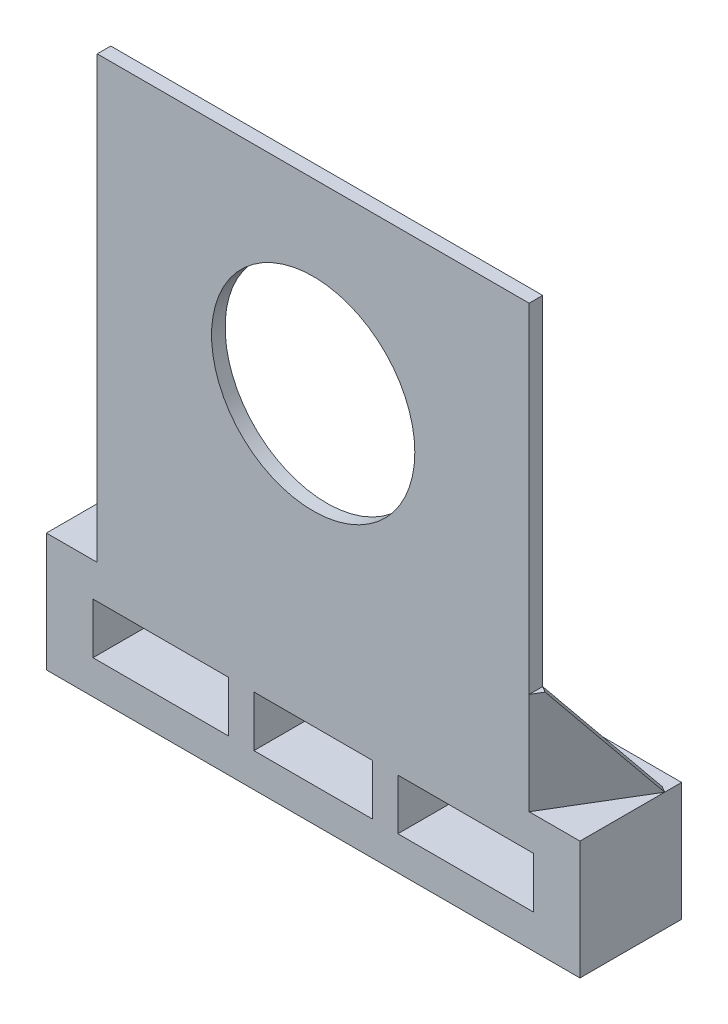
ISO-10303-21;
HEADER;
FILE_DESCRIPTION(('STEP AP214'),'2;1');
FILE_NAME('part.step','',(''),(''),'','','');
FILE_SCHEMA(('AUTOMOTIVE_DESIGN { 1 0 10303 214 1 1 1 1 }'));
ENDSEC;
DATA;
#1=APPLICATION_CONTEXT('core data for automotive mechanical design processes');
#2=APPLICATION_PROTOCOL_DEFINITION('international standard','automotive_design',2000,#1);
#3=PRODUCT_CONTEXT('',#1,'mechanical');
#4=PRODUCT('Part','Part','',(#3));
#5=PRODUCT_RELATED_PRODUCT_CATEGORY('part','',(#4));
#6=PRODUCT_DEFINITION_FORMATION('','',#4);
#7=PRODUCT_DEFINITION_CONTEXT('part definition',#1,'design');
#8=PRODUCT_DEFINITION('design','',#6,#7);
#9=PRODUCT_DEFINITION_SHAPE('','',#8);
#10=(LENGTH_UNIT() NAMED_UNIT(*) SI_UNIT(.MILLI.,.METRE.));
#11=(NAMED_UNIT(*) PLANE_ANGLE_UNIT() SI_UNIT($,.RADIAN.));
#12=(NAMED_UNIT(*) SI_UNIT($,.STERADIAN.) SOLID_ANGLE_UNIT());
#13=UNCERTAINTY_MEASURE_WITH_UNIT(LENGTH_MEASURE(1.E-05),#10,'distance_accuracy_value','');
#14=(GEOMETRIC_REPRESENTATION_CONTEXT(3) GLOBAL_UNCERTAINTY_ASSIGNED_CONTEXT((#13)) GLOBAL_UNIT_ASSIGNED_CONTEXT((#10,
#11,#12)) REPRESENTATION_CONTEXT('',''));
#15=CARTESIAN_POINT('',(0.,0.,0.));
#16=DIRECTION('',(0.,0.,1.));
#17=DIRECTION('',(1.,0.,0.));
#18=AXIS2_PLACEMENT_3D('',#15,#16,#17);
#19=CARTESIAN_POINT('',(0.,-130.,-52.));
#20=DIRECTION('',(0.,1.,0.));
#21=DIRECTION('',(0.,0.,1.));
#22=AXIS2_PLACEMENT_3D('',#19,#20,#21);
#23=PLANE('',#22);
#24=DIRECTION('',(0.857492925712544,0.,-0.514495755427527));
#25=VECTOR('',#24,1.);
#26=CARTESIAN_POINT('',(-157.5,-130.,-42.));
#27=LINE('',#26,#25);
#28=CARTESIAN_POINT('',(-157.5,-130.,-42.));
#29=VERTEX_POINT('',#28);
#30=CARTESIAN_POINT('',(-153.970588235294,-130.,-44.1176470588236));
#31=VERTEX_POINT('',#30);
#32=EDGE_CURVE('E206',#29,#31,#27,.T.);
#33=ORIENTED_EDGE('',*,*,#32,.T.);
#34=DIRECTION('',(0.514495755427527,0.,0.857492925712544));
#35=VECTOR('',#34,1.);
#36=CARTESIAN_POINT('',(-127.5,-130.,0.));
#37=LINE('',#36,#35);
#38=CARTESIAN_POINT('',(-127.5,-130.,0.));
#39=VERTEX_POINT('',#38);
#40=EDGE_CURVE('E215',#31,#39,#37,.T.);
#41=ORIENTED_EDGE('',*,*,#40,.T.);
#42=DIRECTION('',(1.,0.,0.));
#43=VECTOR('',#42,1.);
#44=CARTESIAN_POINT('',(-127.5,-130.,0.));
#45=LINE('',#44,#43);
#46=CARTESIAN_POINT('',(127.5,-130.,0.));
#47=VERTEX_POINT('',#46);
#48=EDGE_CURVE('E275',#39,#47,#45,.T.);
#49=ORIENTED_EDGE('',*,*,#48,.T.);
#50=DIRECTION('',(-0.514495755427527,0.,0.857492925712544));
#51=VECTOR('',#50,1.);
#52=CARTESIAN_POINT('',(127.5,-130.,0.));
#53=LINE('',#52,#51);
#54=CARTESIAN_POINT('',(153.970588235294,-130.,-44.1176470588235));
#55=VERTEX_POINT('',#54);
#56=EDGE_CURVE('E309',#55,#47,#53,.T.);
#57=ORIENTED_EDGE('',*,*,#56,.F.);
#58=DIRECTION('',(-0.857492925712544,0.,-0.514495755427527));
#59=VECTOR('',#58,1.);
#60=CARTESIAN_POINT('',(157.5,-130.,-42.));
#61=LINE('',#60,#59);
#62=CARTESIAN_POINT('',(157.5,-130.,-42.));
#63=VERTEX_POINT('',#62);
#64=EDGE_CURVE('E314',#63,#55,#61,.T.);
#65=ORIENTED_EDGE('',*,*,#64,.F.);
#66=DIRECTION('',(0.,0.,1.));
#67=VECTOR('',#66,1.);
#68=CARTESIAN_POINT('',(157.5,-130.,-52.));
#69=LINE('',#68,#67);
#70=CARTESIAN_POINT('',(157.5,-130.,-52.));
#71=VERTEX_POINT('',#70);
#72=EDGE_CURVE('E256',#71,#63,#69,.T.);
#73=ORIENTED_EDGE('',*,*,#72,.F.);
#74=DIRECTION('',(-1.,0.,0.));
#75=VECTOR('',#74,1.);
#76=CARTESIAN_POINT('',(-157.5,-130.,-52.));
#77=LINE('',#76,#75);
#78=CARTESIAN_POINT('',(-157.5,-130.,-52.));
#79=VERTEX_POINT('',#78);
#80=EDGE_CURVE('E243',#71,#79,#77,.T.);
#81=ORIENTED_EDGE('',*,*,#80,.T.);
#82=DIRECTION('',(0.,0.,1.));
#83=VECTOR('',#82,1.);
#84=CARTESIAN_POINT('',(-157.5,-130.,-52.));
#85=LINE('',#84,#83);
#86=EDGE_CURVE('E236',#79,#29,#85,.T.);
#87=ORIENTED_EDGE('',*,*,#86,.T.);
#88=EDGE_LOOP('',(#33,#41,#49,#57,#65,#73,#81,#87));
#89=FACE_BOUND('',#88,.T.);
#90=ADVANCED_FACE('F41',(#89),#23,.T.);
#91=CARTESIAN_POINT('',(157.5,-130.,8.));
#92=VERTEX_POINT('',#91);
#93=EDGE_CURVE('E429',#63,#92,#69,.T.);
#94=ORIENTED_EDGE('',*,*,#93,.F.);
#95=DIRECTION('',(0.514495755427527,0.,-0.857492925712544));
#96=VECTOR('',#95,1.);
#97=CARTESIAN_POINT('',(127.5,-130.,8.));
#98=LINE('',#97,#96);
#99=CARTESIAN_POINT('',(127.5,-130.,8.));
#100=VERTEX_POINT('',#99);
#101=EDGE_CURVE('E297',#100,#63,#98,.T.);
#102=ORIENTED_EDGE('',*,*,#101,.F.);
#103=DIRECTION('',(-1.,0.,0.));
#104=VECTOR('',#103,1.);
#105=CARTESIAN_POINT('',(0.,-130.,8.));
#106=LINE('',#105,#104);
#107=EDGE_CURVE('E412',#92,#100,#106,.T.);
#108=ORIENTED_EDGE('',*,*,#107,.F.);
#109=EDGE_LOOP('',(#94,#102,#108));
#110=FACE_BOUND('',#109,.T.);
#111=ADVANCED_FACE('F441',(#110),#23,.T.);
#112=DIRECTION('',(-0.514495755427527,0.,-0.857492925712544));
#113=VECTOR('',#112,1.);
#114=CARTESIAN_POINT('',(-127.5,-130.,8.));
#115=LINE('',#114,#113);
#116=CARTESIAN_POINT('',(-127.5,-130.,8.));
#117=VERTEX_POINT('',#116);
#118=EDGE_CURVE('E214',#117,#29,#115,.T.);
#119=ORIENTED_EDGE('',*,*,#118,.T.);
#120=CARTESIAN_POINT('',(-157.5,-130.,8.));
#121=VERTEX_POINT('',#120);
#122=EDGE_CURVE('E226',#29,#121,#85,.T.);
#123=ORIENTED_EDGE('',*,*,#122,.T.);
#124=EDGE_CURVE('E228',#117,#121,#106,.T.);
#125=ORIENTED_EDGE('',*,*,#124,.F.);
#126=EDGE_LOOP('',(#119,#123,#125));
#127=FACE_BOUND('',#126,.T.);
#128=ADVANCED_FACE('F225',(#127),#23,.T.);
#129=CARTESIAN_POINT('',(0.,0.,8.));
#130=DIRECTION('',(0.,0.,1.));
#131=DIRECTION('',(1.,0.,0.));
#132=AXIS2_PLACEMENT_3D('',#129,#130,#131);
#133=PLANE('',#132);
#134=DIRECTION('',(0.,1.,0.));
#135=VECTOR('',#134,1.);
#136=CARTESIAN_POINT('',(127.5,130.,8.));
#137=LINE('',#136,#135);
#138=CARTESIAN_POINT('',(127.5,-70.,8.));
#139=VERTEX_POINT('',#138);
#140=EDGE_CURVE('E257',#100,#139,#137,.T.);
#141=ORIENTED_EDGE('',*,*,#140,.T.);
#142=CARTESIAN_POINT('',(127.5,130.,8.));
#143=VERTEX_POINT('',#142);
#144=EDGE_CURVE('E261',#139,#143,#137,.T.);
#145=ORIENTED_EDGE('',*,*,#144,.T.);
#146=DIRECTION('',(-1.,0.,0.));
#147=VECTOR('',#146,1.);
#148=CARTESIAN_POINT('',(-127.5,130.,8.));
#149=LINE('',#148,#147);
#150=CARTESIAN_POINT('',(-127.5,130.,8.));
#151=VERTEX_POINT('',#150);
#152=EDGE_CURVE('E260',#143,#151,#149,.T.);
#153=ORIENTED_EDGE('',*,*,#152,.T.);
#154=DIRECTION('',(0.,-1.,0.));
#155=VECTOR('',#154,1.);
#156=CARTESIAN_POINT('',(-127.5,130.,8.));
#157=LINE('',#156,#155);
#158=CARTESIAN_POINT('',(-127.5,-70.,8.));
#159=VERTEX_POINT('',#158);
#160=EDGE_CURVE('E263',#151,#159,#157,.T.);
#161=ORIENTED_EDGE('',*,*,#160,.T.);
#162=DIRECTION('',(0.,-1.,0.));
#163=VECTOR('',#162,1.);
#164=CARTESIAN_POINT('',(-127.5,-70.,8.));
#165=LINE('',#164,#163);
#166=EDGE_CURVE('E492',#159,#117,#165,.T.);
#167=ORIENTED_EDGE('',*,*,#166,.T.);
#168=ORIENTED_EDGE('',*,*,#124,.T.);
#169=DIRECTION('',(0.,-1.,0.));
#170=VECTOR('',#169,1.);
#171=CARTESIAN_POINT('',(-157.5,-200.,8.));
#172=LINE('',#171,#170);
#173=CARTESIAN_POINT('',(-157.5,-200.,8.));
#174=VERTEX_POINT('',#173);
#175=EDGE_CURVE('E239',#121,#174,#172,.T.);
#176=ORIENTED_EDGE('',*,*,#175,.T.);
#177=DIRECTION('',(1.,0.,0.));
#178=VECTOR('',#177,1.);
#179=CARTESIAN_POINT('',(157.5,-200.,8.));
#180=LINE('',#179,#178);
#181=CARTESIAN_POINT('',(157.5,-200.,8.));
#182=VERTEX_POINT('',#181);
#183=EDGE_CURVE('E420',#174,#182,#180,.T.);
#184=ORIENTED_EDGE('',*,*,#183,.T.);
#185=DIRECTION('',(0.,1.,0.));
#186=VECTOR('',#185,1.);
#187=CARTESIAN_POINT('',(157.5,-130.,8.));
#188=LINE('',#187,#186);
#189=EDGE_CURVE('E423',#182,#92,#188,.T.);
#190=ORIENTED_EDGE('',*,*,#189,.T.);
#191=ORIENTED_EDGE('',*,*,#107,.T.);
#192=EDGE_LOOP('',(#141,#145,#153,#161,#167,#168,#176,#184,#190,#191));
#193=FACE_BOUND('',#192,.T.);
#194=CARTESIAN_POINT('',(0.,20.,8.));
#195=DIRECTION('',(0.,0.,1.));
#196=DIRECTION('',(1.,0.,0.));
#197=AXIS2_PLACEMENT_3D('',#194,#195,#196);
#198=CIRCLE('',#197,60.);
#199=CARTESIAN_POINT('',(60.,20.,8.));
#200=VERTEX_POINT('',#199);
#201=EDGE_CURVE('E249',#200,#200,#198,.T.);
#202=ORIENTED_EDGE('',*,*,#201,.F.);
#203=EDGE_LOOP('',(#202));
#204=FACE_BOUND('',#203,.T.);
#205=DIRECTION('',(-1.,0.,0.));
#206=VECTOR('',#205,1.);
#207=CARTESIAN_POINT('',(-130.,-150.,8.));
#208=LINE('',#207,#206);
#209=CARTESIAN_POINT('',(-50.,-150.,8.));
#210=VERTEX_POINT('',#209);
#211=CARTESIAN_POINT('',(-130.,-150.,8.));
#212=VERTEX_POINT('',#211);
#213=EDGE_CURVE('E307',#210,#212,#208,.T.);
#214=ORIENTED_EDGE('',*,*,#213,.F.);
#215=DIRECTION('',(0.,1.,0.));
#216=VECTOR('',#215,1.);
#217=CARTESIAN_POINT('',(-50.,-150.,8.));
#218=LINE('',#217,#216);
#219=CARTESIAN_POINT('',(-50.,-180.,8.));
#220=VERTEX_POINT('',#219);
#221=EDGE_CURVE('E305',#220,#210,#218,.T.);
#222=ORIENTED_EDGE('',*,*,#221,.F.);
#223=DIRECTION('',(1.,0.,0.));
#224=VECTOR('',#223,1.);
#225=CARTESIAN_POINT('',(-130.,-180.,8.));
#226=LINE('',#225,#224);
#227=CARTESIAN_POINT('',(-130.,-180.,8.));
#228=VERTEX_POINT('',#227);
#229=EDGE_CURVE('E321',#228,#220,#226,.T.);
#230=ORIENTED_EDGE('',*,*,#229,.F.);
#231=DIRECTION('',(0.,-1.,0.));
#232=VECTOR('',#231,1.);
#233=CARTESIAN_POINT('',(-130.,-150.,8.));
#234=LINE('',#233,#232);
#235=EDGE_CURVE('E333',#212,#228,#234,.T.);
#236=ORIENTED_EDGE('',*,*,#235,.F.);
#237=EDGE_LOOP('',(#214,#222,#230,#236));
#238=FACE_BOUND('',#237,.T.);
#239=DIRECTION('',(-1.,0.,0.));
#240=VECTOR('',#239,1.);
#241=CARTESIAN_POINT('',(50.,-150.,8.));
#242=LINE('',#241,#240);
#243=CARTESIAN_POINT('',(130.,-150.,8.));
#244=VERTEX_POINT('',#243);
#245=CARTESIAN_POINT('',(50.,-150.,8.));
#246=VERTEX_POINT('',#245);
#247=EDGE_CURVE('E362',#244,#246,#242,.T.);
#248=ORIENTED_EDGE('',*,*,#247,.F.);
#249=DIRECTION('',(0.,1.,0.));
#250=VECTOR('',#249,1.);
#251=CARTESIAN_POINT('',(130.,-150.,8.));
#252=LINE('',#251,#250);
#253=CARTESIAN_POINT('',(130.,-180.,8.));
#254=VERTEX_POINT('',#253);
#255=EDGE_CURVE('E340',#254,#244,#252,.T.);
#256=ORIENTED_EDGE('',*,*,#255,.F.);
#257=DIRECTION('',(1.,0.,0.));
#258=VECTOR('',#257,1.);
#259=CARTESIAN_POINT('',(50.,-180.,8.));
#260=LINE('',#259,#258);
#261=CARTESIAN_POINT('',(50.,-180.,8.));
#262=VERTEX_POINT('',#261);
#263=EDGE_CURVE('E351',#262,#254,#260,.T.);
#264=ORIENTED_EDGE('',*,*,#263,.F.);
#265=DIRECTION('',(0.,-1.,0.));
#266=VECTOR('',#265,1.);
#267=CARTESIAN_POINT('',(50.,-150.,8.));
#268=LINE('',#267,#266);
#269=EDGE_CURVE('E365',#246,#262,#268,.T.);
#270=ORIENTED_EDGE('',*,*,#269,.F.);
#271=EDGE_LOOP('',(#248,#256,#264,#270));
#272=FACE_BOUND('',#271,.T.);
#273=DIRECTION('',(-1.,0.,0.));
#274=VECTOR('',#273,1.);
#275=CARTESIAN_POINT('',(-35.,-150.,8.));
#276=LINE('',#275,#274);
#277=CARTESIAN_POINT('',(35.,-150.,8.));
#278=VERTEX_POINT('',#277);
#279=CARTESIAN_POINT('',(-35.,-150.,8.));
#280=VERTEX_POINT('',#279);
#281=EDGE_CURVE('E394',#278,#280,#276,.T.);
#282=ORIENTED_EDGE('',*,*,#281,.F.);
#283=DIRECTION('',(0.,1.,0.));
#284=VECTOR('',#283,1.);
#285=CARTESIAN_POINT('',(35.,-150.,8.));
#286=LINE('',#285,#284);
#287=CARTESIAN_POINT('',(35.,-180.,8.));
#288=VERTEX_POINT('',#287);
#289=EDGE_CURVE('E372',#288,#278,#286,.T.);
#290=ORIENTED_EDGE('',*,*,#289,.F.);
#291=DIRECTION('',(1.,0.,0.));
#292=VECTOR('',#291,1.);
#293=CARTESIAN_POINT('',(-35.,-180.,8.));
#294=LINE('',#293,#292);
#295=CARTESIAN_POINT('',(-35.,-180.,8.));
#296=VERTEX_POINT('',#295);
#297=EDGE_CURVE('E383',#296,#288,#294,.T.);
#298=ORIENTED_EDGE('',*,*,#297,.F.);
#299=DIRECTION('',(0.,-1.,0.));
#300=VECTOR('',#299,1.);
#301=CARTESIAN_POINT('',(-35.,-150.,8.));
#302=LINE('',#301,#300);
#303=EDGE_CURVE('E397',#280,#296,#302,.T.);
#304=ORIENTED_EDGE('',*,*,#303,.F.);
#305=EDGE_LOOP('',(#282,#290,#298,#304));
#306=FACE_BOUND('',#305,.T.);
#307=ADVANCED_FACE('F439',(#193,#204,#238,#272,#306),#133,.T.);
#308=CARTESIAN_POINT('',(0.,0.,0.));
#309=DIRECTION('',(0.,0.,1.));
#310=DIRECTION('',(1.,0.,0.));
#311=AXIS2_PLACEMENT_3D('',#308,#309,#310);
#312=PLANE('',#311);
#313=DIRECTION('',(0.,1.,0.));
#314=VECTOR('',#313,1.);
#315=CARTESIAN_POINT('',(127.5,130.,0.));
#316=LINE('',#315,#314);
#317=CARTESIAN_POINT('',(127.5,-70.,0.));
#318=VERTEX_POINT('',#317);
#319=EDGE_CURVE('E267',#47,#318,#316,.T.);
#320=ORIENTED_EDGE('',*,*,#319,.F.);
#321=ORIENTED_EDGE('',*,*,#48,.F.);
#322=DIRECTION('',(0.,-1.,0.));
#323=VECTOR('',#322,1.);
#324=CARTESIAN_POINT('',(-127.5,-70.,0.));
#325=LINE('',#324,#323);
#326=CARTESIAN_POINT('',(-127.5,-70.,0.));
#327=VERTEX_POINT('',#326);
#328=EDGE_CURVE('E299',#327,#39,#325,.T.);
#329=ORIENTED_EDGE('',*,*,#328,.F.);
#330=DIRECTION('',(0.,-1.,0.));
#331=VECTOR('',#330,1.);
#332=CARTESIAN_POINT('',(-127.5,130.,0.));
#333=LINE('',#332,#331);
#334=CARTESIAN_POINT('',(-127.5,130.,0.));
#335=VERTEX_POINT('',#334);
#336=EDGE_CURVE('E272',#335,#327,#333,.T.);
#337=ORIENTED_EDGE('',*,*,#336,.F.);
#338=DIRECTION('',(-1.,0.,0.));
#339=VECTOR('',#338,1.);
#340=CARTESIAN_POINT('',(-127.5,130.,0.));
#341=LINE('',#340,#339);
#342=CARTESIAN_POINT('',(127.5,130.,0.));
#343=VERTEX_POINT('',#342);
#344=EDGE_CURVE('E270',#343,#335,#341,.T.);
#345=ORIENTED_EDGE('',*,*,#344,.F.);
#346=EDGE_CURVE('E252',#318,#343,#316,.T.);
#347=ORIENTED_EDGE('',*,*,#346,.F.);
#348=EDGE_LOOP('',(#320,#321,#329,#337,#345,#347));
#349=FACE_BOUND('',#348,.T.);
#350=CARTESIAN_POINT('',(0.,20.,0.));
#351=DIRECTION('',(0.,0.,1.));
#352=DIRECTION('',(1.,0.,0.));
#353=AXIS2_PLACEMENT_3D('',#350,#351,#352);
#354=CIRCLE('',#353,60.);
#355=CARTESIAN_POINT('',(60.,20.,0.));
#356=VERTEX_POINT('',#355);
#357=EDGE_CURVE('E253',#356,#356,#354,.T.);
#358=ORIENTED_EDGE('',*,*,#357,.T.);
#359=EDGE_LOOP('',(#358));
#360=FACE_BOUND('',#359,.T.);
#361=ADVANCED_FACE('F466',(#349,#360),#312,.F.);
#362=CARTESIAN_POINT('',(127.5,130.,8.));
#363=DIRECTION('',(-1.,0.,0.));
#364=DIRECTION('',(0.,0.,1.));
#365=AXIS2_PLACEMENT_3D('',#362,#363,#364);
#366=PLANE('',#365);
#367=ORIENTED_EDGE('',*,*,#144,.F.);
#368=DIRECTION('',(0.,0.,1.));
#369=VECTOR('',#368,1.);
#370=CARTESIAN_POINT('',(127.5,-70.,8.));
#371=LINE('',#370,#369);
#372=EDGE_CURVE('E303',#318,#139,#371,.T.);
#373=ORIENTED_EDGE('',*,*,#372,.F.);
#374=ORIENTED_EDGE('',*,*,#346,.T.);
#375=DIRECTION('',(0.,0.,-1.));
#376=VECTOR('',#375,1.);
#377=CARTESIAN_POINT('',(127.5,130.,8.));
#378=LINE('',#377,#376);
#379=EDGE_CURVE('E280',#143,#343,#378,.T.);
#380=ORIENTED_EDGE('',*,*,#379,.F.);
#381=EDGE_LOOP('',(#367,#373,#374,#380));
#382=FACE_BOUND('',#381,.T.);
#383=ADVANCED_FACE('F43',(#382),#366,.F.);
#384=CARTESIAN_POINT('',(-127.5,130.,8.));
#385=DIRECTION('',(0.,-1.,0.));
#386=DIRECTION('',(0.,0.,-1.));
#387=AXIS2_PLACEMENT_3D('',#384,#385,#386);
#388=PLANE('',#387);
#389=ORIENTED_EDGE('',*,*,#344,.T.);
#390=DIRECTION('',(0.,0.,-1.));
#391=VECTOR('',#390,1.);
#392=CARTESIAN_POINT('',(-127.5,130.,8.));
#393=LINE('',#392,#391);
#394=EDGE_CURVE('E266',#151,#335,#393,.T.);
#395=ORIENTED_EDGE('',*,*,#394,.F.);
#396=ORIENTED_EDGE('',*,*,#152,.F.);
#397=ORIENTED_EDGE('',*,*,#379,.T.);
#398=EDGE_LOOP('',(#389,#395,#396,#397));
#399=FACE_BOUND('',#398,.T.);
#400=ADVANCED_FACE('F471',(#399),#388,.F.);
#401=CARTESIAN_POINT('',(-127.5,130.,8.));
#402=DIRECTION('',(1.,0.,0.));
#403=DIRECTION('',(0.,1.,0.));
#404=AXIS2_PLACEMENT_3D('',#401,#402,#403);
#405=PLANE('',#404);
#406=ORIENTED_EDGE('',*,*,#336,.T.);
#407=DIRECTION('',(0.,0.,1.));
#408=VECTOR('',#407,1.);
#409=CARTESIAN_POINT('',(-127.5,-70.,8.));
#410=LINE('',#409,#408);
#411=EDGE_CURVE('E229',#327,#159,#410,.T.);
#412=ORIENTED_EDGE('',*,*,#411,.T.);
#413=ORIENTED_EDGE('',*,*,#160,.F.);
#414=ORIENTED_EDGE('',*,*,#394,.T.);
#415=EDGE_LOOP('',(#406,#412,#413,#414));
#416=FACE_BOUND('',#415,.T.);
#417=ADVANCED_FACE('F462',(#416),#405,.F.);
#418=CARTESIAN_POINT('',(0.,20.,8.));
#419=DIRECTION('',(0.,0.,-1.));
#420=DIRECTION('',(-1.,0.,0.));
#421=AXIS2_PLACEMENT_3D('',#418,#419,#420);
#422=CYLINDRICAL_SURFACE('',#421,60.);
#423=ORIENTED_EDGE('',*,*,#201,.T.);
#424=EDGE_LOOP('',(#423));
#425=FACE_BOUND('',#424,.T.);
#426=ORIENTED_EDGE('',*,*,#357,.F.);
#427=EDGE_LOOP('',(#426));
#428=FACE_BOUND('',#427,.T.);
#429=ADVANCED_FACE('F455',(#425,#428),#422,.F.);
#430=CARTESIAN_POINT('',(157.5,-130.,-52.));
#431=DIRECTION('',(1.,0.,0.));
#432=DIRECTION('',(0.,0.,-1.));
#433=AXIS2_PLACEMENT_3D('',#430,#431,#432);
#434=PLANE('',#433);
#435=ORIENTED_EDGE('',*,*,#189,.F.);
#436=DIRECTION('',(0.,0.,1.));
#437=VECTOR('',#436,1.);
#438=CARTESIAN_POINT('',(157.5,-200.,-52.));
#439=LINE('',#438,#437);
#440=CARTESIAN_POINT('',(157.5,-200.,-52.));
#441=VERTEX_POINT('',#440);
#442=EDGE_CURVE('E245',#441,#182,#439,.T.);
#443=ORIENTED_EDGE('',*,*,#442,.F.);
#444=DIRECTION('',(0.,1.,0.));
#445=VECTOR('',#444,1.);
#446=CARTESIAN_POINT('',(157.5,-130.,-52.));
#447=LINE('',#446,#445);
#448=EDGE_CURVE('E240',#441,#71,#447,.T.);
#449=ORIENTED_EDGE('',*,*,#448,.T.);
#450=ORIENTED_EDGE('',*,*,#72,.T.);
#451=ORIENTED_EDGE('',*,*,#93,.T.);
#452=EDGE_LOOP('',(#435,#443,#449,#450,#451));
#453=FACE_BOUND('',#452,.T.);
#454=ADVANCED_FACE('F435',(#453),#434,.T.);
#455=CARTESIAN_POINT('',(157.5,-200.,-52.));
#456=DIRECTION('',(0.,-1.,0.));
#457=DIRECTION('',(1.,0.,0.));
#458=AXIS2_PLACEMENT_3D('',#455,#456,#457);
#459=PLANE('',#458);
#460=ORIENTED_EDGE('',*,*,#183,.F.);
#461=DIRECTION('',(0.,0.,1.));
#462=VECTOR('',#461,1.);
#463=CARTESIAN_POINT('',(-157.5,-200.,-52.));
#464=LINE('',#463,#462);
#465=CARTESIAN_POINT('',(-157.5,-200.,-52.));
#466=VERTEX_POINT('',#465);
#467=EDGE_CURVE('E244',#466,#174,#464,.T.);
#468=ORIENTED_EDGE('',*,*,#467,.F.);
#469=DIRECTION('',(1.,0.,0.));
#470=VECTOR('',#469,1.);
#471=CARTESIAN_POINT('',(157.5,-200.,-52.));
#472=LINE('',#471,#470);
#473=EDGE_CURVE('E414',#466,#441,#472,.T.);
#474=ORIENTED_EDGE('',*,*,#473,.T.);
#475=ORIENTED_EDGE('',*,*,#442,.T.);
#476=EDGE_LOOP('',(#460,#468,#474,#475));
#477=FACE_BOUND('',#476,.T.);
#478=ADVANCED_FACE('F454',(#477),#459,.T.);
#479=CARTESIAN_POINT('',(-157.5,-200.,-52.));
#480=DIRECTION('',(-1.,0.,0.));
#481=DIRECTION('',(0.,0.,1.));
#482=AXIS2_PLACEMENT_3D('',#479,#480,#481);
#483=PLANE('',#482);
#484=ORIENTED_EDGE('',*,*,#175,.F.);
#485=ORIENTED_EDGE('',*,*,#122,.F.);
#486=ORIENTED_EDGE('',*,*,#86,.F.);
#487=DIRECTION('',(0.,-1.,0.));
#488=VECTOR('',#487,1.);
#489=CARTESIAN_POINT('',(-157.5,-200.,-52.));
#490=LINE('',#489,#488);
#491=EDGE_CURVE('E411',#79,#466,#490,.T.);
#492=ORIENTED_EDGE('',*,*,#491,.T.);
#493=ORIENTED_EDGE('',*,*,#467,.T.);
#494=EDGE_LOOP('',(#484,#485,#486,#492,#493));
#495=FACE_BOUND('',#494,.T.);
#496=ADVANCED_FACE('F234',(#495),#483,.T.);
#497=CARTESIAN_POINT('',(0.,0.,-52.));
#498=DIRECTION('',(0.,0.,-1.));
#499=DIRECTION('',(-1.,0.,0.));
#500=AXIS2_PLACEMENT_3D('',#497,#498,#499);
#501=PLANE('',#500);
#502=DIRECTION('',(0.,1.,0.));
#503=VECTOR('',#502,1.);
#504=CARTESIAN_POINT('',(-50.,-150.,-52.));
#505=LINE('',#504,#503);
#506=CARTESIAN_POINT('',(-50.,-180.,-52.));
#507=VERTEX_POINT('',#506);
#508=CARTESIAN_POINT('',(-50.,-150.,-52.));
#509=VERTEX_POINT('',#508);
#510=EDGE_CURVE('E317',#507,#509,#505,.T.);
#511=ORIENTED_EDGE('',*,*,#510,.T.);
#512=DIRECTION('',(-1.,0.,0.));
#513=VECTOR('',#512,1.);
#514=CARTESIAN_POINT('',(-130.,-150.,-52.));
#515=LINE('',#514,#513);
#516=CARTESIAN_POINT('',(-130.,-150.,-52.));
#517=VERTEX_POINT('',#516);
#518=EDGE_CURVE('E320',#509,#517,#515,.T.);
#519=ORIENTED_EDGE('',*,*,#518,.T.);
#520=DIRECTION('',(0.,-1.,0.));
#521=VECTOR('',#520,1.);
#522=CARTESIAN_POINT('',(-130.,-150.,-52.));
#523=LINE('',#522,#521);
#524=CARTESIAN_POINT('',(-130.,-180.,-52.));
#525=VERTEX_POINT('',#524);
#526=EDGE_CURVE('E324',#517,#525,#523,.T.);
#527=ORIENTED_EDGE('',*,*,#526,.T.);
#528=DIRECTION('',(1.,0.,0.));
#529=VECTOR('',#528,1.);
#530=CARTESIAN_POINT('',(-130.,-180.,-52.));
#531=LINE('',#530,#529);
#532=EDGE_CURVE('E327',#525,#507,#531,.T.);
#533=ORIENTED_EDGE('',*,*,#532,.T.);
#534=EDGE_LOOP('',(#511,#519,#527,#533));
#535=FACE_BOUND('',#534,.T.);
#536=DIRECTION('',(0.,1.,0.));
#537=VECTOR('',#536,1.);
#538=CARTESIAN_POINT('',(130.,-150.,-52.));
#539=LINE('',#538,#537);
#540=CARTESIAN_POINT('',(130.,-180.,-52.));
#541=VERTEX_POINT('',#540);
#542=CARTESIAN_POINT('',(130.,-150.,-52.));
#543=VERTEX_POINT('',#542);
#544=EDGE_CURVE('E347',#541,#543,#539,.T.);
#545=ORIENTED_EDGE('',*,*,#544,.T.);
#546=DIRECTION('',(-1.,0.,0.));
#547=VECTOR('',#546,1.);
#548=CARTESIAN_POINT('',(50.,-150.,-52.));
#549=LINE('',#548,#547);
#550=CARTESIAN_POINT('',(50.,-150.,-52.));
#551=VERTEX_POINT('',#550);
#552=EDGE_CURVE('E350',#543,#551,#549,.T.);
#553=ORIENTED_EDGE('',*,*,#552,.T.);
#554=DIRECTION('',(0.,-1.,0.));
#555=VECTOR('',#554,1.);
#556=CARTESIAN_POINT('',(50.,-150.,-52.));
#557=LINE('',#556,#555);
#558=CARTESIAN_POINT('',(50.,-180.,-52.));
#559=VERTEX_POINT('',#558);
#560=EDGE_CURVE('E354',#551,#559,#557,.T.);
#561=ORIENTED_EDGE('',*,*,#560,.T.);
#562=DIRECTION('',(1.,0.,0.));
#563=VECTOR('',#562,1.);
#564=CARTESIAN_POINT('',(50.,-180.,-52.));
#565=LINE('',#564,#563);
#566=EDGE_CURVE('E357',#559,#541,#565,.T.);
#567=ORIENTED_EDGE('',*,*,#566,.T.);
#568=EDGE_LOOP('',(#545,#553,#561,#567));
#569=FACE_BOUND('',#568,.T.);
#570=DIRECTION('',(0.,1.,0.));
#571=VECTOR('',#570,1.);
#572=CARTESIAN_POINT('',(35.,-150.,-52.));
#573=LINE('',#572,#571);
#574=CARTESIAN_POINT('',(35.,-180.,-52.));
#575=VERTEX_POINT('',#574);
#576=CARTESIAN_POINT('',(35.,-150.,-52.));
#577=VERTEX_POINT('',#576);
#578=EDGE_CURVE('E379',#575,#577,#573,.T.);
#579=ORIENTED_EDGE('',*,*,#578,.T.);
#580=DIRECTION('',(-1.,0.,0.));
#581=VECTOR('',#580,1.);
#582=CARTESIAN_POINT('',(-35.,-150.,-52.));
#583=LINE('',#582,#581);
#584=CARTESIAN_POINT('',(-35.,-150.,-52.));
#585=VERTEX_POINT('',#584);
#586=EDGE_CURVE('E382',#577,#585,#583,.T.);
#587=ORIENTED_EDGE('',*,*,#586,.T.);
#588=DIRECTION('',(0.,-1.,0.));
#589=VECTOR('',#588,1.);
#590=CARTESIAN_POINT('',(-35.,-150.,-52.));
#591=LINE('',#590,#589);
#592=CARTESIAN_POINT('',(-35.,-180.,-52.));
#593=VERTEX_POINT('',#592);
#594=EDGE_CURVE('E386',#585,#593,#591,.T.);
#595=ORIENTED_EDGE('',*,*,#594,.T.);
#596=DIRECTION('',(1.,0.,0.));
#597=VECTOR('',#596,1.);
#598=CARTESIAN_POINT('',(-35.,-180.,-52.));
#599=LINE('',#598,#597);
#600=EDGE_CURVE('E389',#593,#575,#599,.T.);
#601=ORIENTED_EDGE('',*,*,#600,.T.);
#602=EDGE_LOOP('',(#579,#587,#595,#601));
#603=FACE_BOUND('',#602,.T.);
#604=ORIENTED_EDGE('',*,*,#80,.F.);
#605=ORIENTED_EDGE('',*,*,#448,.F.);
#606=ORIENTED_EDGE('',*,*,#473,.F.);
#607=ORIENTED_EDGE('',*,*,#491,.F.);
#608=EDGE_LOOP('',(#604,#605,#606,#607));
#609=FACE_BOUND('',#608,.T.);
#610=ADVANCED_FACE('F450',(#535,#569,#603,#609),#501,.T.);
#611=CARTESIAN_POINT('',(35.,-150.,-52.));
#612=DIRECTION('',(1.,0.,0.));
#613=DIRECTION('',(0.,1.,0.));
#614=AXIS2_PLACEMENT_3D('',#611,#612,#613);
#615=PLANE('',#614);
#616=ORIENTED_EDGE('',*,*,#289,.T.);
#617=DIRECTION('',(0.,0.,1.));
#618=VECTOR('',#617,1.);
#619=CARTESIAN_POINT('',(35.,-150.,-52.));
#620=LINE('',#619,#618);
#621=EDGE_CURVE('E392',#577,#278,#620,.T.);
#622=ORIENTED_EDGE('',*,*,#621,.F.);
#623=ORIENTED_EDGE('',*,*,#578,.F.);
#624=DIRECTION('',(0.,0.,1.));
#625=VECTOR('',#624,1.);
#626=CARTESIAN_POINT('',(35.,-180.,-52.));
#627=LINE('',#626,#625);
#628=EDGE_CURVE('E402',#575,#288,#627,.T.);
#629=ORIENTED_EDGE('',*,*,#628,.T.);
#630=EDGE_LOOP('',(#616,#622,#623,#629));
#631=FACE_BOUND('',#630,.T.);
#632=ADVANCED_FACE('F557',(#631),#615,.F.);
#633=CARTESIAN_POINT('',(-35.,-180.,-52.));
#634=DIRECTION('',(0.,-1.,0.));
#635=DIRECTION('',(1.,0.,0.));
#636=AXIS2_PLACEMENT_3D('',#633,#634,#635);
#637=PLANE('',#636);
#638=ORIENTED_EDGE('',*,*,#297,.T.);
#639=ORIENTED_EDGE('',*,*,#628,.F.);
#640=ORIENTED_EDGE('',*,*,#600,.F.);
#641=DIRECTION('',(0.,0.,1.));
#642=VECTOR('',#641,1.);
#643=CARTESIAN_POINT('',(-35.,-180.,-52.));
#644=LINE('',#643,#642);
#645=EDGE_CURVE('E404',#593,#296,#644,.T.);
#646=ORIENTED_EDGE('',*,*,#645,.T.);
#647=EDGE_LOOP('',(#638,#639,#640,#646));
#648=FACE_BOUND('',#647,.T.);
#649=ADVANCED_FACE('F553',(#648),#637,.F.);
#650=CARTESIAN_POINT('',(-35.,-150.,-52.));
#651=DIRECTION('',(-1.,0.,0.));
#652=DIRECTION('',(0.,-1.,0.));
#653=AXIS2_PLACEMENT_3D('',#650,#651,#652);
#654=PLANE('',#653);
#655=ORIENTED_EDGE('',*,*,#303,.T.);
#656=ORIENTED_EDGE('',*,*,#645,.F.);
#657=ORIENTED_EDGE('',*,*,#594,.F.);
#658=DIRECTION('',(0.,0.,1.));
#659=VECTOR('',#658,1.);
#660=CARTESIAN_POINT('',(-35.,-150.,-52.));
#661=LINE('',#660,#659);
#662=EDGE_CURVE('E406',#585,#280,#661,.T.);
#663=ORIENTED_EDGE('',*,*,#662,.T.);
#664=EDGE_LOOP('',(#655,#656,#657,#663));
#665=FACE_BOUND('',#664,.T.);
#666=ADVANCED_FACE('F556',(#665),#654,.F.);
#667=CARTESIAN_POINT('',(-35.,-150.,-52.));
#668=DIRECTION('',(0.,1.,0.));
#669=DIRECTION('',(0.,0.,1.));
#670=AXIS2_PLACEMENT_3D('',#667,#668,#669);
#671=PLANE('',#670);
#672=ORIENTED_EDGE('',*,*,#281,.T.);
#673=ORIENTED_EDGE('',*,*,#662,.F.);
#674=ORIENTED_EDGE('',*,*,#586,.F.);
#675=ORIENTED_EDGE('',*,*,#621,.T.);
#676=EDGE_LOOP('',(#672,#673,#674,#675));
#677=FACE_BOUND('',#676,.T.);
#678=ADVANCED_FACE('F551',(#677),#671,.F.);
#679=CARTESIAN_POINT('',(130.,-150.,-52.));
#680=DIRECTION('',(1.,0.,0.));
#681=DIRECTION('',(0.,1.,0.));
#682=AXIS2_PLACEMENT_3D('',#679,#680,#681);
#683=PLANE('',#682);
#684=ORIENTED_EDGE('',*,*,#255,.T.);
#685=DIRECTION('',(0.,0.,1.));
#686=VECTOR('',#685,1.);
#687=CARTESIAN_POINT('',(130.,-150.,-52.));
#688=LINE('',#687,#686);
#689=EDGE_CURVE('E360',#543,#244,#688,.T.);
#690=ORIENTED_EDGE('',*,*,#689,.F.);
#691=ORIENTED_EDGE('',*,*,#544,.F.);
#692=DIRECTION('',(0.,0.,1.));
#693=VECTOR('',#692,1.);
#694=CARTESIAN_POINT('',(130.,-180.,-52.));
#695=LINE('',#694,#693);
#696=EDGE_CURVE('E370',#541,#254,#695,.T.);
#697=ORIENTED_EDGE('',*,*,#696,.T.);
#698=EDGE_LOOP('',(#684,#690,#691,#697));
#699=FACE_BOUND('',#698,.T.);
#700=ADVANCED_FACE('F541',(#699),#683,.F.);
#701=CARTESIAN_POINT('',(50.,-180.,-52.));
#702=DIRECTION('',(0.,-1.,0.));
#703=DIRECTION('',(0.,0.,-1.));
#704=AXIS2_PLACEMENT_3D('',#701,#702,#703);
#705=PLANE('',#704);
#706=ORIENTED_EDGE('',*,*,#263,.T.);
#707=ORIENTED_EDGE('',*,*,#696,.F.);
#708=ORIENTED_EDGE('',*,*,#566,.F.);
#709=DIRECTION('',(0.,0.,1.));
#710=VECTOR('',#709,1.);
#711=CARTESIAN_POINT('',(50.,-180.,-52.));
#712=LINE('',#711,#710);
#713=EDGE_CURVE('E373',#559,#262,#712,.T.);
#714=ORIENTED_EDGE('',*,*,#713,.T.);
#715=EDGE_LOOP('',(#706,#707,#708,#714));
#716=FACE_BOUND('',#715,.T.);
#717=ADVANCED_FACE('F537',(#716),#705,.F.);
#718=CARTESIAN_POINT('',(50.,-150.,-52.));
#719=DIRECTION('',(-1.,0.,0.));
#720=DIRECTION('',(0.,-1.,0.));
#721=AXIS2_PLACEMENT_3D('',#718,#719,#720);
#722=PLANE('',#721);
#723=ORIENTED_EDGE('',*,*,#269,.T.);
#724=ORIENTED_EDGE('',*,*,#713,.F.);
#725=ORIENTED_EDGE('',*,*,#560,.F.);
#726=DIRECTION('',(0.,0.,1.));
#727=VECTOR('',#726,1.);
#728=CARTESIAN_POINT('',(50.,-150.,-52.));
#729=LINE('',#728,#727);
#730=EDGE_CURVE('E375',#551,#246,#729,.T.);
#731=ORIENTED_EDGE('',*,*,#730,.T.);
#732=EDGE_LOOP('',(#723,#724,#725,#731));
#733=FACE_BOUND('',#732,.T.);
#734=ADVANCED_FACE('F540',(#733),#722,.F.);
#735=CARTESIAN_POINT('',(50.,-150.,-52.));
#736=DIRECTION('',(0.,1.,0.));
#737=DIRECTION('',(0.,0.,1.));
#738=AXIS2_PLACEMENT_3D('',#735,#736,#737);
#739=PLANE('',#738);
#740=ORIENTED_EDGE('',*,*,#247,.T.);
#741=ORIENTED_EDGE('',*,*,#730,.F.);
#742=ORIENTED_EDGE('',*,*,#552,.F.);
#743=ORIENTED_EDGE('',*,*,#689,.T.);
#744=EDGE_LOOP('',(#740,#741,#742,#743));
#745=FACE_BOUND('',#744,.T.);
#746=ADVANCED_FACE('F535',(#745),#739,.F.);
#747=CARTESIAN_POINT('',(-50.,-150.,-52.));
#748=DIRECTION('',(1.,0.,0.));
#749=DIRECTION('',(0.,1.,0.));
#750=AXIS2_PLACEMENT_3D('',#747,#748,#749);
#751=PLANE('',#750);
#752=ORIENTED_EDGE('',*,*,#221,.T.);
#753=DIRECTION('',(0.,0.,1.));
#754=VECTOR('',#753,1.);
#755=CARTESIAN_POINT('',(-50.,-150.,-52.));
#756=LINE('',#755,#754);
#757=EDGE_CURVE('E329',#509,#210,#756,.T.);
#758=ORIENTED_EDGE('',*,*,#757,.F.);
#759=ORIENTED_EDGE('',*,*,#510,.F.);
#760=DIRECTION('',(0.,0.,1.));
#761=VECTOR('',#760,1.);
#762=CARTESIAN_POINT('',(-50.,-180.,-52.));
#763=LINE('',#762,#761);
#764=EDGE_CURVE('E338',#507,#220,#763,.T.);
#765=ORIENTED_EDGE('',*,*,#764,.T.);
#766=EDGE_LOOP('',(#752,#758,#759,#765));
#767=FACE_BOUND('',#766,.T.);
#768=ADVANCED_FACE('F525',(#767),#751,.F.);
#769=CARTESIAN_POINT('',(-130.,-180.,-52.));
#770=DIRECTION('',(0.,-1.,0.));
#771=DIRECTION('',(1.,0.,0.));
#772=AXIS2_PLACEMENT_3D('',#769,#770,#771);
#773=PLANE('',#772);
#774=ORIENTED_EDGE('',*,*,#229,.T.);
#775=ORIENTED_EDGE('',*,*,#764,.F.);
#776=ORIENTED_EDGE('',*,*,#532,.F.);
#777=DIRECTION('',(0.,0.,1.));
#778=VECTOR('',#777,1.);
#779=CARTESIAN_POINT('',(-130.,-180.,-52.));
#780=LINE('',#779,#778);
#781=EDGE_CURVE('E341',#525,#228,#780,.T.);
#782=ORIENTED_EDGE('',*,*,#781,.T.);
#783=EDGE_LOOP('',(#774,#775,#776,#782));
#784=FACE_BOUND('',#783,.T.);
#785=ADVANCED_FACE('F521',(#784),#773,.F.);
#786=CARTESIAN_POINT('',(-130.,-150.,-52.));
#787=DIRECTION('',(-1.,0.,0.));
#788=DIRECTION('',(0.,-1.,0.));
#789=AXIS2_PLACEMENT_3D('',#786,#787,#788);
#790=PLANE('',#789);
#791=ORIENTED_EDGE('',*,*,#235,.T.);
#792=ORIENTED_EDGE('',*,*,#781,.F.);
#793=ORIENTED_EDGE('',*,*,#526,.F.);
#794=DIRECTION('',(0.,0.,1.));
#795=VECTOR('',#794,1.);
#796=CARTESIAN_POINT('',(-130.,-150.,-52.));
#797=LINE('',#796,#795);
#798=EDGE_CURVE('E343',#517,#212,#797,.T.);
#799=ORIENTED_EDGE('',*,*,#798,.T.);
#800=EDGE_LOOP('',(#791,#792,#793,#799));
#801=FACE_BOUND('',#800,.T.);
#802=ADVANCED_FACE('F524',(#801),#790,.F.);
#803=CARTESIAN_POINT('',(-130.,-150.,-52.));
#804=DIRECTION('',(0.,1.,0.));
#805=DIRECTION('',(0.,0.,1.));
#806=AXIS2_PLACEMENT_3D('',#803,#804,#805);
#807=PLANE('',#806);
#808=ORIENTED_EDGE('',*,*,#213,.T.);
#809=ORIENTED_EDGE('',*,*,#798,.F.);
#810=ORIENTED_EDGE('',*,*,#518,.F.);
#811=ORIENTED_EDGE('',*,*,#757,.T.);
#812=EDGE_LOOP('',(#808,#809,#810,#811));
#813=FACE_BOUND('',#812,.T.);
#814=ADVANCED_FACE('F520',(#813),#807,.F.);
#815=CARTESIAN_POINT('',(127.5,-70.,8.));
#816=DIRECTION('',(-0.857492925712544,0.,-0.514495755427527));
#817=DIRECTION('',(-0.514495755427527,0.,0.857492925712544));
#818=AXIS2_PLACEMENT_3D('',#815,#816,#817);
#819=PLANE('',#818);
#820=ORIENTED_EDGE('',*,*,#101,.T.);
#821=DIRECTION('',(0.33490821051683,-0.759125277171481,-0.558180350861383));
#822=VECTOR('',#821,1.);
#823=CARTESIAN_POINT('',(131.029411764706,-70.,2.11764705882351));
#824=LINE('',#823,#822);
#825=CARTESIAN_POINT('',(131.029411764706,-70.,2.11764705882351));
#826=VERTEX_POINT('',#825);
#827=EDGE_CURVE('E286',#826,#63,#824,.T.);
#828=ORIENTED_EDGE('',*,*,#827,.F.);
#829=DIRECTION('',(0.514495755427527,0.,-0.857492925712544));
#830=VECTOR('',#829,1.);
#831=CARTESIAN_POINT('',(127.5,-70.,8.));
#832=LINE('',#831,#830);
#833=EDGE_CURVE('E295',#139,#826,#832,.T.);
#834=ORIENTED_EDGE('',*,*,#833,.F.);
#835=ORIENTED_EDGE('',*,*,#140,.F.);
#836=EDGE_LOOP('',(#820,#828,#834,#835));
#837=FACE_BOUND('',#836,.T.);
#838=ADVANCED_FACE('F294',(#837),#819,.F.);
#839=CARTESIAN_POINT('',(127.5,-70.,0.));
#840=DIRECTION('',(0.857492925712544,0.,0.514495755427527));
#841=DIRECTION('',(0.514495755427527,0.,-0.857492925712544));
#842=AXIS2_PLACEMENT_3D('',#839,#840,#841);
#843=PLANE('',#842);
#844=ORIENTED_EDGE('',*,*,#319,.T.);
#845=DIRECTION('',(0.33490821051683,-0.759125277171481,-0.558180350861383));
#846=VECTOR('',#845,1.);
#847=CARTESIAN_POINT('',(127.5,-70.,0.));
#848=LINE('',#847,#846);
#849=EDGE_CURVE('E289',#318,#55,#848,.T.);
#850=ORIENTED_EDGE('',*,*,#849,.T.);
#851=ORIENTED_EDGE('',*,*,#56,.T.);
#852=EDGE_LOOP('',(#844,#850,#851));
#853=FACE_BOUND('',#852,.T.);
#854=ADVANCED_FACE('F497',(#853),#843,.F.);
#855=CARTESIAN_POINT('',(0.,-70.,0.));
#856=DIRECTION('',(0.,1.,0.));
#857=DIRECTION('',(0.,0.,1.));
#858=AXIS2_PLACEMENT_3D('',#855,#856,#857);
#859=PLANE('',#858);
#860=DIRECTION('',(0.857492925712544,0.,0.514495755427527));
#861=VECTOR('',#860,1.);
#862=CARTESIAN_POINT('',(33.75,-70.,-56.25));
#863=LINE('',#862,#861);
#864=EDGE_CURVE('E49',#318,#826,#863,.T.);
#865=ORIENTED_EDGE('',*,*,#864,.F.);
#866=ORIENTED_EDGE('',*,*,#372,.T.);
#867=ORIENTED_EDGE('',*,*,#833,.T.);
#868=EDGE_LOOP('',(#865,#866,#867));
#869=FACE_BOUND('',#868,.T.);
#870=ADVANCED_FACE('F301',(#869),#859,.T.);
#871=CARTESIAN_POINT('',(79.5798362219532,-70.,-28.7520982668281));
#872=DIRECTION('',(-0.390566732942472,-0.650944554904119,0.650944554904119));
#873=DIRECTION('',(0.,-0.707106781186547,-0.707106781186548));
#874=AXIS2_PLACEMENT_3D('',#871,#872,#873);
#875=PLANE('',#874);
#876=ORIENTED_EDGE('',*,*,#864,.T.);
#877=ORIENTED_EDGE('',*,*,#827,.T.);
#878=ORIENTED_EDGE('',*,*,#64,.T.);
#879=ORIENTED_EDGE('',*,*,#849,.F.);
#880=EDGE_LOOP('',(#876,#877,#878,#879));
#881=FACE_BOUND('',#880,.T.);
#882=ADVANCED_FACE('F285',(#881),#875,.F.);
#883=CARTESIAN_POINT('',(-127.5,-70.,0.));
#884=DIRECTION('',(0.857492925712544,0.,-0.514495755427527));
#885=DIRECTION('',(-0.514495755427527,0.,-0.857492925712544));
#886=AXIS2_PLACEMENT_3D('',#883,#884,#885);
#887=PLANE('',#886);
#888=DIRECTION('',(-0.33490821051683,-0.759125277171481,-0.558180350861383));
#889=VECTOR('',#888,1.);
#890=CARTESIAN_POINT('',(-127.5,-70.,0.));
#891=LINE('',#890,#889);
#892=EDGE_CURVE('E209',#327,#31,#891,.T.);
#893=ORIENTED_EDGE('',*,*,#892,.F.);
#894=ORIENTED_EDGE('',*,*,#328,.T.);
#895=ORIENTED_EDGE('',*,*,#40,.F.);
#896=EDGE_LOOP('',(#893,#894,#895));
#897=FACE_BOUND('',#896,.T.);
#898=ADVANCED_FACE('F503',(#897),#887,.T.);
#899=CARTESIAN_POINT('',(-127.5,-70.,8.));
#900=DIRECTION('',(-0.857492925712544,0.,0.514495755427527));
#901=DIRECTION('',(0.514495755427527,0.,0.857492925712544));
#902=AXIS2_PLACEMENT_3D('',#899,#900,#901);
#903=PLANE('',#902);
#904=DIRECTION('',(0.33490821051683,0.759125277171481,0.558180350861383));
#905=VECTOR('',#904,1.);
#906=CARTESIAN_POINT('',(-131.029411764706,-70.,2.11764705882356));
#907=LINE('',#906,#905);
#908=CARTESIAN_POINT('',(-131.029411764706,-70.,2.1176470588235));
#909=VERTEX_POINT('',#908);
#910=EDGE_CURVE('E55',#29,#909,#907,.T.);
#911=ORIENTED_EDGE('',*,*,#910,.F.);
#912=ORIENTED_EDGE('',*,*,#118,.F.);
#913=ORIENTED_EDGE('',*,*,#166,.F.);
#914=DIRECTION('',(-0.514495755427527,0.,-0.857492925712544));
#915=VECTOR('',#914,1.);
#916=CARTESIAN_POINT('',(-127.5,-70.,8.));
#917=LINE('',#916,#915);
#918=EDGE_CURVE('E62',#159,#909,#917,.T.);
#919=ORIENTED_EDGE('',*,*,#918,.T.);
#920=EDGE_LOOP('',(#911,#912,#913,#919));
#921=FACE_BOUND('',#920,.T.);
#922=ADVANCED_FACE('F219',(#921),#903,.T.);
#923=CARTESIAN_POINT('',(0.,-70.,0.));
#924=DIRECTION('',(0.,1.,0.));
#925=DIRECTION('',(0.,0.,1.));
#926=AXIS2_PLACEMENT_3D('',#923,#924,#925);
#927=PLANE('',#926);
#928=DIRECTION('',(0.857492925712544,0.,-0.514495755427527));
#929=VECTOR('',#928,1.);
#930=CARTESIAN_POINT('',(-33.7500000000001,-70.,-56.25));
#931=LINE('',#930,#929);
#932=EDGE_CURVE('E11',#909,#327,#931,.T.);
#933=ORIENTED_EDGE('',*,*,#932,.F.);
#934=ORIENTED_EDGE('',*,*,#918,.F.);
#935=ORIENTED_EDGE('',*,*,#411,.F.);
#936=EDGE_LOOP('',(#933,#934,#935));
#937=FACE_BOUND('',#936,.T.);
#938=ADVANCED_FACE('F502',(#937),#927,.T.);
#939=CARTESIAN_POINT('',(-79.5798362219533,-70.,-28.7520982668281));
#940=DIRECTION('',(0.390566732942472,-0.65094455490412,0.650944554904119));
#941=DIRECTION('',(0.,-0.707106781186547,-0.707106781186548));
#942=AXIS2_PLACEMENT_3D('',#939,#940,#941);
#943=PLANE('',#942);
#944=ORIENTED_EDGE('',*,*,#892,.T.);
#945=ORIENTED_EDGE('',*,*,#32,.F.);
#946=ORIENTED_EDGE('',*,*,#910,.T.);
#947=ORIENTED_EDGE('',*,*,#932,.T.);
#948=EDGE_LOOP('',(#944,#945,#946,#947));
#949=FACE_BOUND('',#948,.T.);
#950=ADVANCED_FACE('F207',(#949),#943,.F.);
#951=CLOSED_SHELL('',(#90,#111,#128,#307,#361,#383,#400,#417,#429,#454,#478,#496,#610,#632,#649,
#666,#678,#700,#717,#734,#746,#768,#785,#802,#814,#838,#854,#870,#882,#898,#922,#938,#950));
#952=MANIFOLD_SOLID_BREP('B2',#951);
#953=ADVANCED_BREP_SHAPE_REPRESENTATION('',(#18,#952),#14);
#954=SHAPE_DEFINITION_REPRESENTATION(#9,#953);
ENDSEC;
END-ISO-10303-21;
